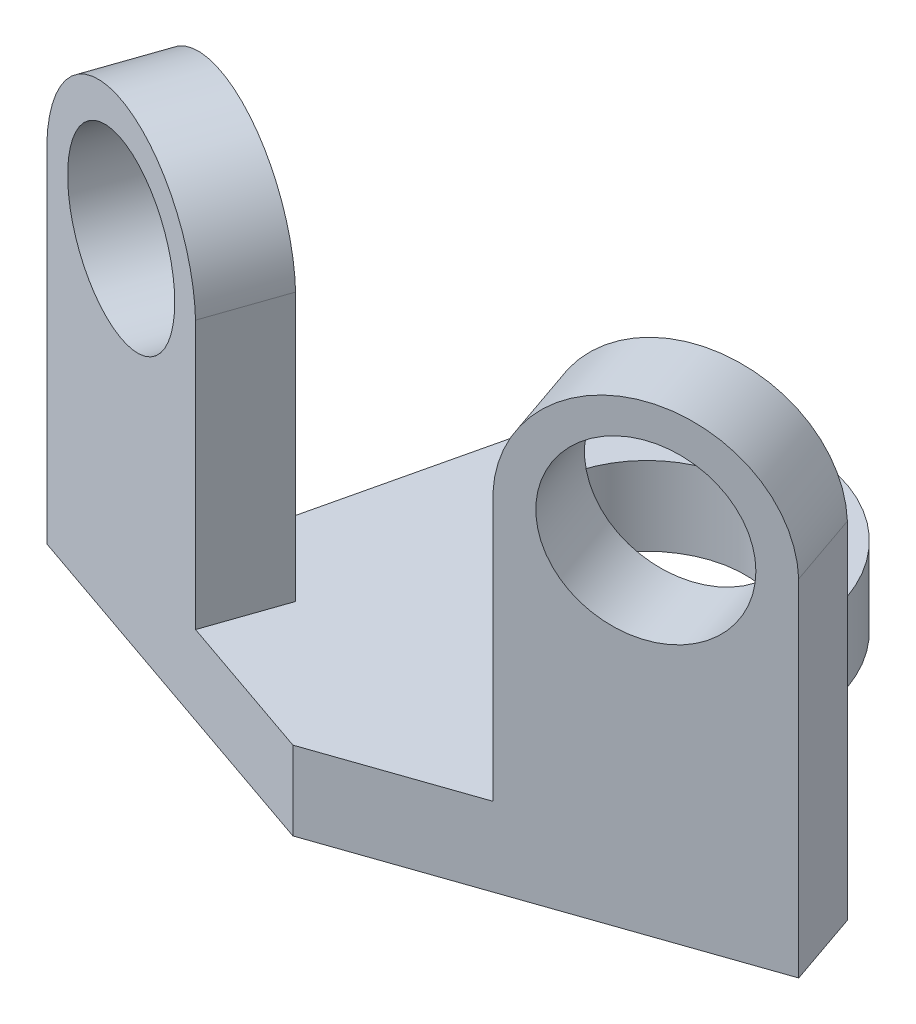
ISO-10303-21;
HEADER;
FILE_DESCRIPTION(('STEP AP214'),'2;1');
FILE_NAME('part.step','',(''),(''),'','','');
FILE_SCHEMA(('AUTOMOTIVE_DESIGN { 1 0 10303 214 1 1 1 1 }'));
ENDSEC;
DATA;
#1=APPLICATION_CONTEXT('core data for automotive mechanical design processes');
#2=APPLICATION_PROTOCOL_DEFINITION('international standard','automotive_design',2000,#1);
#3=PRODUCT_CONTEXT('',#1,'mechanical');
#4=PRODUCT('Part','Part','',(#3));
#5=PRODUCT_RELATED_PRODUCT_CATEGORY('part','',(#4));
#6=PRODUCT_DEFINITION_FORMATION('','',#4);
#7=PRODUCT_DEFINITION_CONTEXT('part definition',#1,'design');
#8=PRODUCT_DEFINITION('design','',#6,#7);
#9=PRODUCT_DEFINITION_SHAPE('','',#8);
#10=(LENGTH_UNIT() NAMED_UNIT(*) SI_UNIT(.MILLI.,.METRE.));
#11=(NAMED_UNIT(*) PLANE_ANGLE_UNIT() SI_UNIT($,.RADIAN.));
#12=(NAMED_UNIT(*) SI_UNIT($,.STERADIAN.) SOLID_ANGLE_UNIT());
#13=UNCERTAINTY_MEASURE_WITH_UNIT(LENGTH_MEASURE(1.E-05),#10,'distance_accuracy_value','');
#14=(GEOMETRIC_REPRESENTATION_CONTEXT(3) GLOBAL_UNCERTAINTY_ASSIGNED_CONTEXT((#13)) GLOBAL_UNIT_ASSIGNED_CONTEXT((#10,
#11,#12)) REPRESENTATION_CONTEXT('',''));
#15=CARTESIAN_POINT('',(0.,0.,0.));
#16=DIRECTION('',(0.,0.,1.));
#17=DIRECTION('',(1.,0.,0.));
#18=AXIS2_PLACEMENT_3D('',#15,#16,#17);
#19=CARTESIAN_POINT('',(-10.6231637501647,10.,30.7501203221128));
#20=DIRECTION('',(-0.326531097263396,0.,0.945186459128548));
#21=DIRECTION('',(0.945186459128548,0.,0.326531097263396));
#22=AXIS2_PLACEMENT_3D('',#19,#20,#21);
#23=PLANE('',#22);
#24=CARTESIAN_POINT('',(-30.0830952149119,43.332246409548,24.0273486271894));
#25=DIRECTION('',(-0.326531097263396,0.,0.945186459128548));
#26=DIRECTION('',(0.945186459128548,0.,0.326531097263396));
#27=AXIS2_PLACEMENT_3D('',#24,#25,#26);
#28=CIRCLE('',#27,11.);
#29=CARTESIAN_POINT('',(-19.6860441644978,43.332246409548,27.6191906970867));
#30=VERTEX_POINT('',#29);
#31=EDGE_CURVE('E147',#30,#30,#28,.T.);
#32=ORIENTED_EDGE('',*,*,#31,.T.);
#33=EDGE_LOOP('',(#32));
#34=FACE_BOUND('',#33,.T.);
#35=CARTESIAN_POINT('',(-30.0830952149119,43.332246409548,24.0273486271894));
#36=DIRECTION('',(-0.326531097263396,0.,0.945186459128548));
#37=DIRECTION('',(0.945186459128548,0.,0.326531097263396));
#38=AXIS2_PLACEMENT_3D('',#35,#36,#37);
#39=CIRCLE('',#38,15.3);
#40=CARTESIAN_POINT('',(-15.638418209937,44.0667946577472,29.0175134634466));
#41=VERTEX_POINT('',#40);
#42=CARTESIAN_POINT('',(-44.5277722198867,44.0667946577471,19.0371837909321));
#43=VERTEX_POINT('',#42);
#44=EDGE_CURVE('E238',#41,#43,#39,.T.);
#45=ORIENTED_EDGE('',*,*,#44,.F.);
#46=DIRECTION('',(0.,-1.,0.));
#47=VECTOR('',#46,1.);
#48=CARTESIAN_POINT('',(-15.638418209937,60.,29.0175134634466));
#49=LINE('',#48,#47);
#50=CARTESIAN_POINT('',(-15.638418209937,10.,29.0175134634466));
#51=VERTEX_POINT('',#50);
#52=EDGE_CURVE('E163',#41,#51,#49,.T.);
#53=ORIENTED_EDGE('',*,*,#52,.T.);
#54=DIRECTION('',(-0.945186459128548,0.,-0.326531097263396));
#55=VECTOR('',#54,1.);
#56=CARTESIAN_POINT('',(-44.5277722198867,10.,19.0371837909321));
#57=LINE('',#56,#55);
#58=CARTESIAN_POINT('',(-26.4555609517919,10.,25.2805434141621));
#59=VERTEX_POINT('',#58);
#60=EDGE_CURVE('E166',#51,#59,#57,.T.);
#61=ORIENTED_EDGE('',*,*,#60,.T.);
#62=DIRECTION('',(0.,-1.,0.));
#63=VECTOR('',#62,1.);
#64=CARTESIAN_POINT('',(-26.4555609517919,10.,25.2805434141621));
#65=LINE('',#64,#63);
#66=CARTESIAN_POINT('',(-26.4555609517919,0.,25.2805434141621));
#67=VERTEX_POINT('',#66);
#68=EDGE_CURVE('E229',#59,#67,#65,.T.);
#69=ORIENTED_EDGE('',*,*,#68,.T.);
#70=DIRECTION('',(-0.945186459128548,0.,-0.326531097263396));
#71=VECTOR('',#70,1.);
#72=CARTESIAN_POINT('',(-10.6231637501647,0.,30.7501203221128));
#73=LINE('',#72,#71);
#74=CARTESIAN_POINT('',(-44.5277722198867,0.,19.0371837909321));
#75=VERTEX_POINT('',#74);
#76=EDGE_CURVE('E193',#67,#75,#73,.T.);
#77=ORIENTED_EDGE('',*,*,#76,.T.);
#78=DIRECTION('',(0.,-1.,0.));
#79=VECTOR('',#78,1.);
#80=CARTESIAN_POINT('',(-44.5277722198867,10.,19.0371837909321));
#81=LINE('',#80,#79);
#82=EDGE_CURVE('E227',#43,#75,#81,.T.);
#83=ORIENTED_EDGE('',*,*,#82,.F.);
#84=EDGE_LOOP('',(#45,#53,#61,#69,#77,#83));
#85=FACE_BOUND('',#84,.T.);
#86=ADVANCED_FACE('F41',(#34,#85),#23,.F.);
#87=CARTESIAN_POINT('',(-33.9046084697219,10.,-11.7129365311808));
#88=DIRECTION('',(0.945186459128548,0.,0.326531097263397));
#89=DIRECTION('',(0.326531097263397,0.,-0.945186459128548));
#90=AXIS2_PLACEMENT_3D('',#87,#88,#89);
#91=PLANE('',#90);
#92=DIRECTION('',(-0.326531097263396,0.,0.945186459128548));
#93=VECTOR('',#92,1.);
#94=CARTESIAN_POINT('',(-31.4665283293508,44.0667946577479,-18.7702745742098));
#95=LINE('',#94,#93);
#96=CARTESIAN_POINT('',(-47.7930831925207,44.0667946577469,28.4890483822176));
#97=VERTEX_POINT('',#96);
#98=EDGE_CURVE('E164',#43,#97,#95,.T.);
#99=ORIENTED_EDGE('',*,*,#98,.F.);
#100=ORIENTED_EDGE('',*,*,#82,.T.);
#101=DIRECTION('',(-0.326531097263397,0.,0.945186459128548));
#102=VECTOR('',#101,1.);
#103=CARTESIAN_POINT('',(-33.9046084697219,0.,-11.7129365311808));
#104=LINE('',#103,#102);
#105=CARTESIAN_POINT('',(-47.7930831925207,0.,28.4890483822176));
#106=VERTEX_POINT('',#105);
#107=EDGE_CURVE('E196',#75,#106,#104,.T.);
#108=ORIENTED_EDGE('',*,*,#107,.T.);
#109=DIRECTION('',(0.,-1.,0.));
#110=VECTOR('',#109,1.);
#111=CARTESIAN_POINT('',(-47.7930831925207,10.,28.4890483822176));
#112=LINE('',#111,#110);
#113=EDGE_CURVE('E225',#97,#106,#112,.T.);
#114=ORIENTED_EDGE('',*,*,#113,.F.);
#115=EDGE_LOOP('',(#99,#100,#108,#114));
#116=FACE_BOUND('',#115,.T.);
#117=ADVANCED_FACE('F281',(#116),#91,.F.);
#118=CARTESIAN_POINT('',(-13.8884747227987,10.,40.2019849133983));
#119=DIRECTION('',(-0.326531097263396,0.,0.945186459128548));
#120=DIRECTION('',(0.945186459128548,0.,0.326531097263396));
#121=AXIS2_PLACEMENT_3D('',#118,#119,#120);
#122=PLANE('',#121);
#123=CARTESIAN_POINT('',(-33.3484061875458,43.332246409548,33.4792132184748));
#124=DIRECTION('',(-0.326531097263396,0.,0.945186459128548));
#125=DIRECTION('',(0.945186459128548,0.,0.326531097263396));
#126=AXIS2_PLACEMENT_3D('',#123,#124,#125);
#127=CIRCLE('',#126,11.);
#128=CARTESIAN_POINT('',(-22.9513551371318,43.332246409548,37.0710552883722));
#129=VERTEX_POINT('',#128);
#130=EDGE_CURVE('E244',#129,#129,#127,.T.);
#131=ORIENTED_EDGE('',*,*,#130,.F.);
#132=EDGE_LOOP('',(#131));
#133=FACE_BOUND('',#132,.T.);
#134=DIRECTION('',(0.,-1.,0.));
#135=VECTOR('',#134,1.);
#136=CARTESIAN_POINT('',(-18.903729182571,60.,38.4693780547321));
#137=LINE('',#136,#135);
#138=CARTESIAN_POINT('',(-18.903729182571,44.066794657747,38.4693780547321));
#139=VERTEX_POINT('',#138);
#140=CARTESIAN_POINT('',(-18.903729182571,10.,38.4693780547321));
#141=VERTEX_POINT('',#140);
#142=EDGE_CURVE('E161',#139,#141,#137,.T.);
#143=ORIENTED_EDGE('',*,*,#142,.F.);
#144=CARTESIAN_POINT('',(-33.3484061875458,43.332246409548,33.4792132184748));
#145=DIRECTION('',(-0.326531097263396,0.,0.945186459128548));
#146=DIRECTION('',(0.945186459128548,0.,0.326531097263396));
#147=AXIS2_PLACEMENT_3D('',#144,#145,#146);
#148=CIRCLE('',#147,15.3);
#149=EDGE_CURVE('E63',#139,#97,#148,.T.);
#150=ORIENTED_EDGE('',*,*,#149,.T.);
#151=ORIENTED_EDGE('',*,*,#113,.T.);
#152=DIRECTION('',(-0.945186459128548,0.,-0.326531097263396));
#153=VECTOR('',#152,1.);
#154=CARTESIAN_POINT('',(-13.8884747227987,0.,40.2019849133983));
#155=LINE('',#154,#153);
#156=CARTESIAN_POINT('',(0.,0.,45.));
#157=VERTEX_POINT('',#156);
#158=EDGE_CURVE('E199',#157,#106,#155,.T.);
#159=ORIENTED_EDGE('',*,*,#158,.F.);
#160=DIRECTION('',(0.,-1.,0.));
#161=VECTOR('',#160,1.);
#162=CARTESIAN_POINT('',(0.,10.,45.));
#163=LINE('',#162,#161);
#164=CARTESIAN_POINT('',(0.,10.,45.));
#165=VERTEX_POINT('',#164);
#166=EDGE_CURVE('E223',#165,#157,#163,.T.);
#167=ORIENTED_EDGE('',*,*,#166,.F.);
#168=DIRECTION('',(-0.945186459128548,0.,-0.326531097263396));
#169=VECTOR('',#168,1.);
#170=CARTESIAN_POINT('',(-13.8884747227987,10.,40.2019849133983));
#171=LINE('',#170,#169);
#172=EDGE_CURVE('E177',#165,#141,#171,.T.);
#173=ORIENTED_EDGE('',*,*,#172,.T.);
#174=EDGE_LOOP('',(#143,#150,#151,#159,#167,#173));
#175=FACE_BOUND('',#174,.T.);
#176=ADVANCED_FACE('F289',(#133,#175),#122,.T.);
#177=CARTESIAN_POINT('',(-15.638418209937,60.,29.0175134634466));
#178=DIRECTION('',(-0.945186459128548,0.,-0.326531097263396));
#179=DIRECTION('',(-0.326531097263396,0.,0.945186459128548));
#180=AXIS2_PLACEMENT_3D('',#177,#178,#179);
#181=PLANE('',#180);
#182=DIRECTION('',(-0.326531097263396,0.,0.945186459128548));
#183=VECTOR('',#182,1.);
#184=CARTESIAN_POINT('',(-2.57717431940118,44.0667946577472,-8.78994490169534));
#185=LINE('',#184,#183);
#186=EDGE_CURVE('E49',#139,#41,#185,.F.);
#187=ORIENTED_EDGE('',*,*,#186,.F.);
#188=ORIENTED_EDGE('',*,*,#142,.T.);
#189=DIRECTION('',(0.326531097263396,0.,-0.945186459128548));
#190=VECTOR('',#189,1.);
#191=CARTESIAN_POINT('',(-15.638418209937,10.,29.0175134634466));
#192=LINE('',#191,#190);
#193=EDGE_CURVE('E157',#141,#51,#192,.T.);
#194=ORIENTED_EDGE('',*,*,#193,.T.);
#195=ORIENTED_EDGE('',*,*,#52,.F.);
#196=EDGE_LOOP('',(#187,#188,#194,#195));
#197=FACE_BOUND('',#196,.T.);
#198=ADVANCED_FACE('F277',(#197),#181,.F.);
#199=CARTESIAN_POINT('',(-19.473997982645,10.,-4.55668767548744));
#200=DIRECTION('',(0.973699899132249,0.,0.227834383774372));
#201=DIRECTION('',(0.227834383774372,0.,-0.973699899132249));
#202=AXIS2_PLACEMENT_3D('',#199,#200,#201);
#203=PLANE('',#202);
#204=DIRECTION('',(-0.227834383774372,0.,0.973699899132249));
#205=VECTOR('',#204,1.);
#206=CARTESIAN_POINT('',(-19.473997982645,0.,-4.55668767548744));
#207=LINE('',#206,#205);
#208=CARTESIAN_POINT('',(-19.473997982645,0.,-4.55668767548745));
#209=VERTEX_POINT('',#208);
#210=EDGE_CURVE('E190',#209,#67,#207,.T.);
#211=ORIENTED_EDGE('',*,*,#210,.T.);
#212=ORIENTED_EDGE('',*,*,#68,.F.);
#213=DIRECTION('',(-0.227834383774372,0.,0.973699899132249));
#214=VECTOR('',#213,1.);
#215=CARTESIAN_POINT('',(-19.473997982645,10.,-4.55668767548744));
#216=LINE('',#215,#214);
#217=CARTESIAN_POINT('',(-19.473997982645,10.,-4.55668767548745));
#218=VERTEX_POINT('',#217);
#219=EDGE_CURVE('E174',#218,#59,#216,.T.);
#220=ORIENTED_EDGE('',*,*,#219,.F.);
#221=DIRECTION('',(0.,-1.,0.));
#222=VECTOR('',#221,1.);
#223=CARTESIAN_POINT('',(-19.473997982645,10.,-4.55668767548745));
#224=LINE('',#223,#222);
#225=EDGE_CURVE('E187',#218,#209,#224,.T.);
#226=ORIENTED_EDGE('',*,*,#225,.T.);
#227=EDGE_LOOP('',(#211,#212,#220,#226));
#228=FACE_BOUND('',#227,.T.);
#229=ADVANCED_FACE('F267',(#228),#203,.F.);
#230=CARTESIAN_POINT('',(13.8884747227987,10.,40.2019849133983));
#231=DIRECTION('',(-0.326531097263396,0.,-0.945186459128548));
#232=DIRECTION('',(-0.945186459128548,0.,0.326531097263396));
#233=AXIS2_PLACEMENT_3D('',#230,#231,#232);
#234=PLANE('',#233);
#235=CARTESIAN_POINT('',(33.3484061875458,43.4533568461685,33.4792132184748));
#236=DIRECTION('',(0.326531097263396,0.,0.945186459128548));
#237=DIRECTION('',(0.945186459128548,0.,-0.326531097263396));
#238=AXIS2_PLACEMENT_3D('',#235,#236,#237);
#239=CIRCLE('',#238,11.);
#240=CARTESIAN_POINT('',(43.7454572379599,43.4533568461685,29.8873711485775));
#241=VERTEX_POINT('',#240);
#242=EDGE_CURVE('E250',#241,#241,#239,.T.);
#243=ORIENTED_EDGE('',*,*,#242,.F.);
#244=EDGE_LOOP('',(#243));
#245=FACE_BOUND('',#244,.T.);
#246=DIRECTION('',(0.,-1.,0.));
#247=VECTOR('',#246,1.);
#248=CARTESIAN_POINT('',(47.7930831925207,10.,28.4890483822176));
#249=LINE('',#248,#247);
#250=CARTESIAN_POINT('',(47.7930831925207,43.936741919306,28.4890483822176));
#251=VERTEX_POINT('',#250);
#252=CARTESIAN_POINT('',(47.7930831925207,0.,28.4890483822176));
#253=VERTEX_POINT('',#252);
#254=EDGE_CURVE('E146',#251,#253,#249,.T.);
#255=ORIENTED_EDGE('',*,*,#254,.F.);
#256=CARTESIAN_POINT('',(33.3484061875458,43.4533568461685,33.4792132184748));
#257=DIRECTION('',(-0.326531097263396,0.,-0.945186459128548));
#258=DIRECTION('',(0.945186459128548,0.,-0.326531097263396));
#259=AXIS2_PLACEMENT_3D('',#256,#257,#258);
#260=CIRCLE('',#259,15.29);
#261=CARTESIAN_POINT('',(18.903729182571,43.9367419193059,38.4693780547321));
#262=VERTEX_POINT('',#261);
#263=EDGE_CURVE('E134',#262,#251,#260,.T.);
#264=ORIENTED_EDGE('',*,*,#263,.F.);
#265=DIRECTION('',(0.,-1.,0.));
#266=VECTOR('',#265,1.);
#267=CARTESIAN_POINT('',(18.903729182571,60.,38.4693780547321));
#268=LINE('',#267,#266);
#269=CARTESIAN_POINT('',(18.903729182571,10.,38.4693780547321));
#270=VERTEX_POINT('',#269);
#271=EDGE_CURVE('E143',#262,#270,#268,.T.);
#272=ORIENTED_EDGE('',*,*,#271,.T.);
#273=DIRECTION('',(0.945186459128548,0.,-0.326531097263396));
#274=VECTOR('',#273,1.);
#275=CARTESIAN_POINT('',(13.8884747227987,10.,40.2019849133983));
#276=LINE('',#275,#274);
#277=EDGE_CURVE('E180',#165,#270,#276,.T.);
#278=ORIENTED_EDGE('',*,*,#277,.F.);
#279=ORIENTED_EDGE('',*,*,#166,.T.);
#280=DIRECTION('',(0.945186459128548,0.,-0.326531097263396));
#281=VECTOR('',#280,1.);
#282=CARTESIAN_POINT('',(13.8884747227987,0.,40.2019849133983));
#283=LINE('',#282,#281);
#284=EDGE_CURVE('E202',#157,#253,#283,.T.);
#285=ORIENTED_EDGE('',*,*,#284,.T.);
#286=EDGE_LOOP('',(#255,#264,#272,#278,#279,#285));
#287=FACE_BOUND('',#286,.T.);
#288=ADVANCED_FACE('F141',(#245,#287),#234,.F.);
#289=CARTESIAN_POINT('',(33.9046084697219,10.,-11.7129365311808));
#290=DIRECTION('',(0.945186459128548,0.,-0.326531097263397));
#291=DIRECTION('',(-0.326531097263397,0.,-0.945186459128548));
#292=AXIS2_PLACEMENT_3D('',#289,#290,#291);
#293=PLANE('',#292);
#294=DIRECTION('',(0.326531097263396,0.,0.945186459128548));
#295=VECTOR('',#294,1.);
#296=CARTESIAN_POINT('',(31.4665283293508,43.9367419193075,-18.7702745742098));
#297=LINE('',#296,#295);
#298=CARTESIAN_POINT('',(44.5277722198867,43.9367419193065,19.0371837909321));
#299=VERTEX_POINT('',#298);
#300=EDGE_CURVE('E241',#251,#299,#297,.F.);
#301=ORIENTED_EDGE('',*,*,#300,.F.);
#302=ORIENTED_EDGE('',*,*,#254,.T.);
#303=DIRECTION('',(0.326531097263397,0.,0.945186459128548));
#304=VECTOR('',#303,1.);
#305=CARTESIAN_POINT('',(33.9046084697219,0.,-11.7129365311808));
#306=LINE('',#305,#304);
#307=CARTESIAN_POINT('',(44.5277722198867,0.,19.0371837909321));
#308=VERTEX_POINT('',#307);
#309=EDGE_CURVE('E204',#308,#253,#306,.T.);
#310=ORIENTED_EDGE('',*,*,#309,.F.);
#311=DIRECTION('',(0.,-1.,0.));
#312=VECTOR('',#311,1.);
#313=CARTESIAN_POINT('',(44.5277722198867,10.,19.0371837909321));
#314=LINE('',#313,#312);
#315=EDGE_CURVE('E220',#299,#308,#314,.T.);
#316=ORIENTED_EDGE('',*,*,#315,.F.);
#317=EDGE_LOOP('',(#301,#302,#310,#316));
#318=FACE_BOUND('',#317,.T.);
#319=ADVANCED_FACE('F266',(#318),#293,.T.);
#320=CARTESIAN_POINT('',(10.6231637501647,10.,30.7501203221128));
#321=DIRECTION('',(-0.326531097263396,0.,-0.945186459128548));
#322=DIRECTION('',(-0.945186459128548,0.,0.326531097263396));
#323=AXIS2_PLACEMENT_3D('',#320,#321,#322);
#324=PLANE('',#323);
#325=CARTESIAN_POINT('',(30.0830952149119,43.4533568461685,24.0273486271894));
#326=DIRECTION('',(0.326531097263396,0.,0.945186459128548));
#327=DIRECTION('',(0.945186459128548,0.,-0.326531097263396));
#328=AXIS2_PLACEMENT_3D('',#325,#326,#327);
#329=CIRCLE('',#328,11.);
#330=CARTESIAN_POINT('',(40.4801462653259,43.4533568461685,20.435506557292));
#331=VERTEX_POINT('',#330);
#332=EDGE_CURVE('E247',#331,#331,#329,.T.);
#333=ORIENTED_EDGE('',*,*,#332,.T.);
#334=EDGE_LOOP('',(#333));
#335=FACE_BOUND('',#334,.T.);
#336=CARTESIAN_POINT('',(30.0830952149119,43.4533568461685,24.0273486271894));
#337=DIRECTION('',(-0.326531097263396,0.,-0.945186459128548));
#338=DIRECTION('',(-0.945186459128548,0.,0.326531097263396));
#339=AXIS2_PLACEMENT_3D('',#336,#337,#338);
#340=CIRCLE('',#339,15.29);
#341=CARTESIAN_POINT('',(15.638418209937,43.9367419193064,29.0175134634466));
#342=VERTEX_POINT('',#341);
#343=EDGE_CURVE('E56',#299,#342,#340,.F.);
#344=ORIENTED_EDGE('',*,*,#343,.F.);
#345=ORIENTED_EDGE('',*,*,#315,.T.);
#346=DIRECTION('',(0.945186459128548,0.,-0.326531097263396));
#347=VECTOR('',#346,1.);
#348=CARTESIAN_POINT('',(10.6231637501647,0.,30.7501203221128));
#349=LINE('',#348,#347);
#350=CARTESIAN_POINT('',(26.455560951792,0.,25.2805434141621));
#351=VERTEX_POINT('',#350);
#352=EDGE_CURVE('E207',#351,#308,#349,.T.);
#353=ORIENTED_EDGE('',*,*,#352,.F.);
#354=DIRECTION('',(0.,-1.,0.));
#355=VECTOR('',#354,1.);
#356=CARTESIAN_POINT('',(26.455560951792,10.,25.2805434141621));
#357=LINE('',#356,#355);
#358=CARTESIAN_POINT('',(26.455560951792,10.,25.2805434141621));
#359=VERTEX_POINT('',#358);
#360=EDGE_CURVE('E218',#359,#351,#357,.T.);
#361=ORIENTED_EDGE('',*,*,#360,.F.);
#362=DIRECTION('',(-0.945186459128548,0.,0.326531097263396));
#363=VECTOR('',#362,1.);
#364=CARTESIAN_POINT('',(44.5277722198867,10.,19.0371837909321));
#365=LINE('',#364,#363);
#366=CARTESIAN_POINT('',(15.638418209937,10.,29.0175134634466));
#367=VERTEX_POINT('',#366);
#368=EDGE_CURVE('E231',#359,#367,#365,.T.);
#369=ORIENTED_EDGE('',*,*,#368,.T.);
#370=DIRECTION('',(0.,-1.,0.));
#371=VECTOR('',#370,1.);
#372=CARTESIAN_POINT('',(15.638418209937,60.,29.0175134634466));
#373=LINE('',#372,#371);
#374=EDGE_CURVE('E153',#342,#367,#373,.T.);
#375=ORIENTED_EDGE('',*,*,#374,.F.);
#376=EDGE_LOOP('',(#344,#345,#353,#361,#369,#375));
#377=FACE_BOUND('',#376,.T.);
#378=ADVANCED_FACE('F256',(#335,#377),#324,.T.);
#379=CARTESIAN_POINT('',(19.473997982645,10.,-4.55668767548745));
#380=DIRECTION('',(0.973699899132249,0.,-0.227834383774372));
#381=DIRECTION('',(-0.227834383774372,0.,-0.973699899132249));
#382=AXIS2_PLACEMENT_3D('',#379,#380,#381);
#383=PLANE('',#382);
#384=DIRECTION('',(0.227834383774372,0.,0.973699899132249));
#385=VECTOR('',#384,1.);
#386=CARTESIAN_POINT('',(19.473997982645,0.,-4.55668767548745));
#387=LINE('',#386,#385);
#388=CARTESIAN_POINT('',(19.473997982645,0.,-4.55668767548745));
#389=VERTEX_POINT('',#388);
#390=EDGE_CURVE('E210',#389,#351,#387,.T.);
#391=ORIENTED_EDGE('',*,*,#390,.F.);
#392=DIRECTION('',(0.,-1.,0.));
#393=VECTOR('',#392,1.);
#394=CARTESIAN_POINT('',(19.473997982645,10.,-4.55668767548745));
#395=LINE('',#394,#393);
#396=CARTESIAN_POINT('',(19.473997982645,10.,-4.55668767548745));
#397=VERTEX_POINT('',#396);
#398=EDGE_CURVE('E216',#397,#389,#395,.T.);
#399=ORIENTED_EDGE('',*,*,#398,.F.);
#400=DIRECTION('',(0.227834383774372,0.,0.973699899132249));
#401=VECTOR('',#400,1.);
#402=CARTESIAN_POINT('',(19.473997982645,10.,-4.55668767548745));
#403=LINE('',#402,#401);
#404=EDGE_CURVE('E182',#397,#359,#403,.T.);
#405=ORIENTED_EDGE('',*,*,#404,.T.);
#406=ORIENTED_EDGE('',*,*,#360,.T.);
#407=EDGE_LOOP('',(#391,#399,#405,#406));
#408=FACE_BOUND('',#407,.T.);
#409=ADVANCED_FACE('F326',(#408),#383,.T.);
#410=CARTESIAN_POINT('',(0.,10.,0.));
#411=DIRECTION('',(0.,-1.,0.));
#412=DIRECTION('',(0.,0.,-1.));
#413=AXIS2_PLACEMENT_3D('',#410,#411,#412);
#414=CYLINDRICAL_SURFACE('',#413,12.5);
#415=CARTESIAN_POINT('',(0.,10.,0.));
#416=DIRECTION('',(0.,1.,0.));
#417=DIRECTION('',(0.,0.,1.));
#418=AXIS2_PLACEMENT_3D('',#415,#416,#417);
#419=CIRCLE('',#418,12.5);
#420=CARTESIAN_POINT('',(0.,10.,12.5));
#421=VERTEX_POINT('',#420);
#422=EDGE_CURVE('E171',#421,#421,#419,.T.);
#423=ORIENTED_EDGE('',*,*,#422,.T.);
#424=EDGE_LOOP('',(#423));
#425=FACE_BOUND('',#424,.T.);
#426=CARTESIAN_POINT('',(0.,0.,0.));
#427=DIRECTION('',(0.,1.,0.));
#428=DIRECTION('',(0.,0.,1.));
#429=AXIS2_PLACEMENT_3D('',#426,#427,#428);
#430=CIRCLE('',#429,12.5);
#431=CARTESIAN_POINT('',(0.,0.,12.5));
#432=VERTEX_POINT('',#431);
#433=EDGE_CURVE('E155',#432,#432,#430,.T.);
#434=ORIENTED_EDGE('',*,*,#433,.F.);
#435=EDGE_LOOP('',(#434));
#436=FACE_BOUND('',#435,.T.);
#437=ADVANCED_FACE('F43',(#425,#436),#414,.F.);
#438=CARTESIAN_POINT('',(0.,10.,0.));
#439=DIRECTION('',(0.,-1.,0.));
#440=DIRECTION('',(0.,0.,-1.));
#441=AXIS2_PLACEMENT_3D('',#438,#439,#440);
#442=CYLINDRICAL_SURFACE('',#441,20.);
#443=CARTESIAN_POINT('',(0.,0.,0.));
#444=DIRECTION('',(0.,1.,0.));
#445=DIRECTION('',(0.,0.,1.));
#446=AXIS2_PLACEMENT_3D('',#443,#444,#445);
#447=CIRCLE('',#446,20.);
#448=EDGE_CURVE('E175',#389,#209,#447,.T.);
#449=ORIENTED_EDGE('',*,*,#448,.T.);
#450=ORIENTED_EDGE('',*,*,#225,.F.);
#451=CARTESIAN_POINT('',(0.,10.,0.));
#452=DIRECTION('',(0.,1.,0.));
#453=DIRECTION('',(0.,0.,1.));
#454=AXIS2_PLACEMENT_3D('',#451,#452,#453);
#455=CIRCLE('',#454,20.);
#456=EDGE_CURVE('E185',#397,#218,#455,.T.);
#457=ORIENTED_EDGE('',*,*,#456,.F.);
#458=ORIENTED_EDGE('',*,*,#398,.T.);
#459=EDGE_LOOP('',(#449,#450,#457,#458));
#460=FACE_BOUND('',#459,.T.);
#461=ADVANCED_FACE('F331',(#460),#442,.T.);
#462=CARTESIAN_POINT('',(0.,10.,0.));
#463=DIRECTION('',(0.,1.,0.));
#464=DIRECTION('',(0.,0.,1.));
#465=AXIS2_PLACEMENT_3D('',#462,#463,#464);
#466=PLANE('',#465);
#467=DIRECTION('',(0.326531097263396,0.,0.945186459128548));
#468=VECTOR('',#467,1.);
#469=CARTESIAN_POINT('',(15.638418209937,10.,29.0175134634466));
#470=LINE('',#469,#468);
#471=EDGE_CURVE('E152',#367,#270,#470,.T.);
#472=ORIENTED_EDGE('',*,*,#471,.F.);
#473=ORIENTED_EDGE('',*,*,#368,.F.);
#474=ORIENTED_EDGE('',*,*,#404,.F.);
#475=ORIENTED_EDGE('',*,*,#456,.T.);
#476=ORIENTED_EDGE('',*,*,#219,.T.);
#477=ORIENTED_EDGE('',*,*,#60,.F.);
#478=ORIENTED_EDGE('',*,*,#193,.F.);
#479=ORIENTED_EDGE('',*,*,#172,.F.);
#480=ORIENTED_EDGE('',*,*,#277,.T.);
#481=EDGE_LOOP('',(#472,#473,#474,#475,#476,#477,#478,#479,#480));
#482=FACE_BOUND('',#481,.T.);
#483=ORIENTED_EDGE('',*,*,#422,.F.);
#484=EDGE_LOOP('',(#483));
#485=FACE_BOUND('',#484,.T.);
#486=ADVANCED_FACE('F308',(#482,#485),#466,.T.);
#487=CARTESIAN_POINT('',(0.,0.,0.));
#488=DIRECTION('',(0.,1.,0.));
#489=DIRECTION('',(0.,0.,1.));
#490=AXIS2_PLACEMENT_3D('',#487,#488,#489);
#491=PLANE('',#490);
#492=ORIENTED_EDGE('',*,*,#433,.T.);
#493=EDGE_LOOP('',(#492));
#494=FACE_BOUND('',#493,.T.);
#495=ORIENTED_EDGE('',*,*,#210,.F.);
#496=ORIENTED_EDGE('',*,*,#448,.F.);
#497=ORIENTED_EDGE('',*,*,#390,.T.);
#498=ORIENTED_EDGE('',*,*,#352,.T.);
#499=ORIENTED_EDGE('',*,*,#309,.T.);
#500=ORIENTED_EDGE('',*,*,#284,.F.);
#501=ORIENTED_EDGE('',*,*,#158,.T.);
#502=ORIENTED_EDGE('',*,*,#107,.F.);
#503=ORIENTED_EDGE('',*,*,#76,.F.);
#504=EDGE_LOOP('',(#495,#496,#497,#498,#499,#500,#501,#502,#503));
#505=FACE_BOUND('',#504,.T.);
#506=ADVANCED_FACE('F320',(#494,#505),#491,.F.);
#507=CARTESIAN_POINT('',(15.638418209937,60.,29.0175134634466));
#508=DIRECTION('',(0.945186459128548,0.,-0.326531097263396));
#509=DIRECTION('',(-0.326531097263396,0.,-0.945186459128548));
#510=AXIS2_PLACEMENT_3D('',#507,#508,#509);
#511=PLANE('',#510);
#512=ORIENTED_EDGE('',*,*,#271,.F.);
#513=DIRECTION('',(0.326531097263396,0.,0.945186459128548));
#514=VECTOR('',#513,1.);
#515=CARTESIAN_POINT('',(2.57717431940118,43.9367419193064,-8.78994490169534));
#516=LINE('',#515,#514);
#517=EDGE_CURVE('E11',#262,#342,#516,.F.);
#518=ORIENTED_EDGE('',*,*,#517,.T.);
#519=ORIENTED_EDGE('',*,*,#374,.T.);
#520=ORIENTED_EDGE('',*,*,#471,.T.);
#521=EDGE_LOOP('',(#512,#518,#519,#520));
#522=FACE_BOUND('',#521,.T.);
#523=ADVANCED_FACE('F150',(#522),#511,.F.);
#524=CARTESIAN_POINT('',(-17.021851324376,43.332246409548,-13.7801097379526));
#525=DIRECTION('',(-0.326531097263396,0.,0.945186459128548));
#526=DIRECTION('',(0.945186459128548,0.,0.326531097263396));
#527=AXIS2_PLACEMENT_3D('',#524,#525,#526);
#528=CYLINDRICAL_SURFACE('',#527,15.3);
#529=ORIENTED_EDGE('',*,*,#98,.T.);
#530=ORIENTED_EDGE('',*,*,#149,.F.);
#531=ORIENTED_EDGE('',*,*,#186,.T.);
#532=ORIENTED_EDGE('',*,*,#44,.T.);
#533=EDGE_LOOP('',(#529,#530,#531,#532));
#534=FACE_BOUND('',#533,.T.);
#535=ADVANCED_FACE('F314',(#534),#528,.T.);
#536=CARTESIAN_POINT('',(17.021851324376,43.4533568461685,-13.7801097379526));
#537=DIRECTION('',(0.326531097263396,0.,0.945186459128548));
#538=DIRECTION('',(0.945186459128548,0.,-0.326531097263396));
#539=AXIS2_PLACEMENT_3D('',#536,#537,#538);
#540=CYLINDRICAL_SURFACE('',#539,15.29);
#541=ORIENTED_EDGE('',*,*,#300,.T.);
#542=ORIENTED_EDGE('',*,*,#343,.T.);
#543=ORIENTED_EDGE('',*,*,#517,.F.);
#544=ORIENTED_EDGE('',*,*,#263,.T.);
#545=EDGE_LOOP('',(#541,#542,#543,#544));
#546=FACE_BOUND('',#545,.T.);
#547=ADVANCED_FACE('F133',(#546),#540,.T.);
#548=CARTESIAN_POINT('',(-30.0830952149119,43.332246409548,24.0273486271894));
#549=DIRECTION('',(-0.326531097263396,0.,0.945186459128548));
#550=DIRECTION('',(0.945186459128548,0.,0.326531097263396));
#551=AXIS2_PLACEMENT_3D('',#548,#549,#550);
#552=CYLINDRICAL_SURFACE('',#551,11.);
#553=CARTESIAN_POINT('',(-19.6860441644978,43.332246409548,27.6191906970867));
#554=CARTESIAN_POINT('',(-19.7200578204628,43.332246409548,27.7176476199126));
#555=CARTESIAN_POINT('',(-19.7540714764277,43.332246409548,27.8161045427385));
#556=CARTESIAN_POINT('',(-19.8220987883576,43.332246409548,28.0130183883903));
#557=CARTESIAN_POINT('',(-19.8561124443225,43.332246409548,28.1114753112162));
#558=CARTESIAN_POINT('',(-19.9241397562524,43.332246409548,28.3083891568679));
#559=CARTESIAN_POINT('',(-19.9581534122173,43.332246409548,28.4068460796938));
#560=CARTESIAN_POINT('',(-20.0261807241472,43.332246409548,28.6037599253456));
#561=CARTESIAN_POINT('',(-20.0601943801121,43.332246409548,28.7022168481715));
#562=CARTESIAN_POINT('',(-20.128221692042,43.332246409548,28.8991306938233));
#563=CARTESIAN_POINT('',(-20.162235348007,43.332246409548,28.9975876166492));
#564=CARTESIAN_POINT('',(-20.2302626599368,43.332246409548,29.194501462301));
#565=CARTESIAN_POINT('',(-20.2642763159018,43.332246409548,29.2929583851268));
#566=CARTESIAN_POINT('',(-20.3323036278316,43.332246409548,29.4898722307786));
#567=CARTESIAN_POINT('',(-20.3663172837966,43.332246409548,29.5883291536045));
#568=CARTESIAN_POINT('',(-20.4343445957265,43.332246409548,29.7852429992563));
#569=CARTESIAN_POINT('',(-20.4683582516914,43.332246409548,29.8836999220822));
#570=CARTESIAN_POINT('',(-20.5363855636213,43.332246409548,30.080613767734));
#571=CARTESIAN_POINT('',(-20.5703992195862,43.332246409548,30.1790706905599));
#572=CARTESIAN_POINT('',(-20.6384265315161,43.332246409548,30.3759845362116));
#573=CARTESIAN_POINT('',(-20.672440187481,43.332246409548,30.4744414590375));
#574=CARTESIAN_POINT('',(-20.7404674994109,43.332246409548,30.6713553046893));
#575=CARTESIAN_POINT('',(-20.7744811553758,43.332246409548,30.7698122275152));
#576=CARTESIAN_POINT('',(-20.8425084673057,43.332246409548,30.966726073167));
#577=CARTESIAN_POINT('',(-20.8765221232706,43.332246409548,31.0651829959929));
#578=CARTESIAN_POINT('',(-20.9445494352005,43.332246409548,31.2620968416447));
#579=CARTESIAN_POINT('',(-20.9785630911654,43.332246409548,31.3605537644705));
#580=CARTESIAN_POINT('',(-21.0465904030953,43.332246409548,31.5574676101223));
#581=CARTESIAN_POINT('',(-21.0806040590603,43.332246409548,31.6559245329482));
#582=CARTESIAN_POINT('',(-21.1486313709901,43.332246409548,31.8528383786));
#583=CARTESIAN_POINT('',(-21.1826450269551,43.332246409548,31.9512953014259));
#584=CARTESIAN_POINT('',(-21.2506723388849,43.332246409548,32.1482091470777));
#585=CARTESIAN_POINT('',(-21.2846859948499,43.332246409548,32.2466660699036));
#586=CARTESIAN_POINT('',(-21.3527133067798,43.332246409548,32.4435799155553));
#587=CARTESIAN_POINT('',(-21.3867269627447,43.332246409548,32.5420368383812));
#588=CARTESIAN_POINT('',(-21.4547542746746,43.332246409548,32.738950684033));
#589=CARTESIAN_POINT('',(-21.4887679306395,43.332246409548,32.8374076068589));
#590=CARTESIAN_POINT('',(-21.5567952425694,43.332246409548,33.0343214525107));
#591=CARTESIAN_POINT('',(-21.5908088985343,43.332246409548,33.1327783753366));
#592=CARTESIAN_POINT('',(-21.6588362104642,43.332246409548,33.3296922209883));
#593=CARTESIAN_POINT('',(-21.6928498664291,43.332246409548,33.4281491438142));
#594=CARTESIAN_POINT('',(-21.760877178359,43.332246409548,33.625062989466));
#595=CARTESIAN_POINT('',(-21.7948908343239,43.332246409548,33.7235199122919));
#596=CARTESIAN_POINT('',(-21.8629181462538,43.332246409548,33.9204337579437));
#597=CARTESIAN_POINT('',(-21.8969318022187,43.332246409548,34.0188906807696));
#598=CARTESIAN_POINT('',(-21.9649591141486,43.332246409548,34.2158045264214));
#599=CARTESIAN_POINT('',(-21.9989727701136,43.332246409548,34.3142614492473));
#600=CARTESIAN_POINT('',(-22.0670000820434,43.332246409548,34.511175294899));
#601=CARTESIAN_POINT('',(-22.1010137380084,43.332246409548,34.6096322177249));
#602=CARTESIAN_POINT('',(-22.1690410499382,43.332246409548,34.8065460633767));
#603=CARTESIAN_POINT('',(-22.2030547059032,43.332246409548,34.9050029862026));
#604=CARTESIAN_POINT('',(-22.2710820178331,43.332246409548,35.1019168318544));
#605=CARTESIAN_POINT('',(-22.305095673798,43.332246409548,35.2003737546803));
#606=CARTESIAN_POINT('',(-22.3731229857279,43.332246409548,35.397287600332));
#607=CARTESIAN_POINT('',(-22.4071366416928,43.332246409548,35.4957445231579));
#608=CARTESIAN_POINT('',(-22.4751639536227,43.332246409548,35.6926583688097));
#609=CARTESIAN_POINT('',(-22.5091776095876,43.332246409548,35.7911152916356));
#610=CARTESIAN_POINT('',(-22.5772049215175,43.332246409548,35.9880291372874));
#611=CARTESIAN_POINT('',(-22.6112185774824,43.332246409548,36.0864860601133));
#612=CARTESIAN_POINT('',(-22.6792458894123,43.332246409548,36.2833999057651));
#613=CARTESIAN_POINT('',(-22.7132595453772,43.332246409548,36.3818568285909));
#614=CARTESIAN_POINT('',(-22.7812868573071,43.332246409548,36.5787706742427));
#615=CARTESIAN_POINT('',(-22.815300513272,43.332246409548,36.6772275970686));
#616=CARTESIAN_POINT('',(-22.8833278252019,43.332246409548,36.8741414427204));
#617=CARTESIAN_POINT('',(-22.9173414811669,43.332246409548,36.9725983655463));
#618=CARTESIAN_POINT('',(-22.9513551371318,43.332246409548,37.0710552883722));
#619=B_SPLINE_CURVE_WITH_KNOTS('',3,(#553,#554,#555,#556,#557,#558,#559,#560,#561,#562,#563,
#564,#565,#566,#567,#568,#569,#570,#571,#572,#573,#574,#575,#576,#577,#578,#579,#580,#581,#582,
#583,#584,#585,#586,#587,#588,#589,#590,#591,#592,#593,#594,#595,#596,#597,#598,#599,#600,#601,
#602,#603,#604,#605,#606,#607,#608,#609,#610,#611,#612,#613,#614,#615,#616,#617,#618),
.UNSPECIFIED.,.F.,.F.,(4,2,2,2,2,2,2,2,2,2,2,2,2,2,2,2,2,2,2,2,2,2,2,2,2,2,2,2,2,2,2,2,4),(0.,
0.312500000000002,0.625000000000001,0.9375,1.25,1.5625,1.875,2.1875,2.5,2.8125,3.125,3.4375,
3.75,4.0625,4.375,4.68749999999999,5.,5.3125,5.62499999999999,5.9375,6.25,6.56249999999999,
6.875,7.1875,7.49999999999999,7.8125,8.125,8.43749999999999,8.74999999999999,9.0625,
9.37499999999999,9.68749999999999,9.99999999999999),.UNSPECIFIED.);
#620=EDGE_CURVE('BSEAM261',#30,#129,#619,.T.);
#621=ORIENTED_EDGE('',*,*,#31,.F.);
#622=ORIENTED_EDGE('',*,*,#130,.T.);
#623=ORIENTED_EDGE('',*,*,#620,.T.);
#624=ORIENTED_EDGE('',*,*,#620,.F.);
#625=EDGE_LOOP('',(#621,#623,#622,#624));
#626=FACE_BOUND('',#625,.T.);
#627=ADVANCED_FACE('F261',(#626),#552,.F.);
#628=CARTESIAN_POINT('',(30.0830952149119,43.4533568461685,24.0273486271894));
#629=DIRECTION('',(0.326531097263396,0.,0.945186459128548));
#630=DIRECTION('',(0.945186459128548,0.,-0.326531097263396));
#631=AXIS2_PLACEMENT_3D('',#628,#629,#630);
#632=CYLINDRICAL_SURFACE('',#631,11.);
#633=ORIENTED_EDGE('',*,*,#332,.F.);
#634=EDGE_LOOP('',(#633));
#635=FACE_BOUND('',#634,.T.);
#636=ORIENTED_EDGE('',*,*,#242,.T.);
#637=EDGE_LOOP('',(#636));
#638=FACE_BOUND('',#637,.T.);
#639=ADVANCED_FACE('F258',(#635,#638),#632,.F.);
#640=CLOSED_SHELL('',(#86,#117,#176,#198,#229,#288,#319,#378,#409,#437,#461,#486,#506,#523,#535,
#547,#627,#639));
#641=MANIFOLD_SOLID_BREP('B2',#640);
#642=ADVANCED_BREP_SHAPE_REPRESENTATION('',(#18,#641),#14);
#643=SHAPE_DEFINITION_REPRESENTATION(#9,#642);
ENDSEC;
END-ISO-10303-21;
